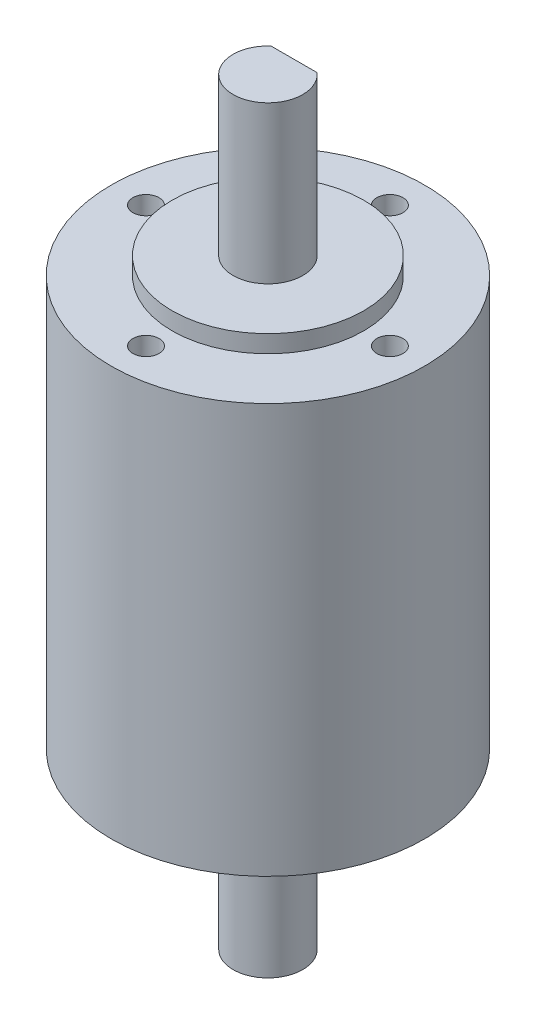
ISO-10303-21;
HEADER;
FILE_DESCRIPTION(('STEP AP214'),'2;1');
FILE_NAME('part.step','',(''),(''),'','','');
FILE_SCHEMA(('AUTOMOTIVE_DESIGN { 1 0 10303 214 1 1 1 1 }'));
ENDSEC;
DATA;
#1=APPLICATION_CONTEXT('core data for automotive mechanical design processes');
#2=APPLICATION_PROTOCOL_DEFINITION('international standard','automotive_design',2000,#1);
#3=PRODUCT_CONTEXT('',#1,'mechanical');
#4=PRODUCT('Part','Part','',(#3));
#5=PRODUCT_RELATED_PRODUCT_CATEGORY('part','',(#4));
#6=PRODUCT_DEFINITION_FORMATION('','',#4);
#7=PRODUCT_DEFINITION_CONTEXT('part definition',#1,'design');
#8=PRODUCT_DEFINITION('design','',#6,#7);
#9=PRODUCT_DEFINITION_SHAPE('','',#8);
#10=(LENGTH_UNIT() NAMED_UNIT(*) SI_UNIT(.MILLI.,.METRE.));
#11=(NAMED_UNIT(*) PLANE_ANGLE_UNIT() SI_UNIT($,.RADIAN.));
#12=(NAMED_UNIT(*) SI_UNIT($,.STERADIAN.) SOLID_ANGLE_UNIT());
#13=UNCERTAINTY_MEASURE_WITH_UNIT(LENGTH_MEASURE(1.E-05),#10,'distance_accuracy_value','');
#14=(GEOMETRIC_REPRESENTATION_CONTEXT(3) GLOBAL_UNCERTAINTY_ASSIGNED_CONTEXT((#13)) GLOBAL_UNIT_ASSIGNED_CONTEXT((#10,
#11,#12)) REPRESENTATION_CONTEXT('',''));
#15=CARTESIAN_POINT('',(0.,0.,0.));
#16=DIRECTION('',(0.,0.,1.));
#17=DIRECTION('',(1.,0.,0.));
#18=AXIS2_PLACEMENT_3D('',#15,#16,#17);
#19=CARTESIAN_POINT('',(0.,47.,0.));
#20=DIRECTION('',(0.,-1.,0.));
#21=DIRECTION('',(0.,0.,-1.));
#22=AXIS2_PLACEMENT_3D('',#19,#20,#21);
#23=CYLINDRICAL_SURFACE('',#22,18.);
#24=CARTESIAN_POINT('',(0.,47.,0.));
#25=DIRECTION('',(0.,1.,0.));
#26=DIRECTION('',(0.,0.,1.));
#27=AXIS2_PLACEMENT_3D('',#24,#25,#26);
#28=CIRCLE('',#27,18.);
#29=CARTESIAN_POINT('',(0.,47.,18.));
#30=VERTEX_POINT('',#29);
#31=EDGE_CURVE('E114',#30,#30,#28,.T.);
#32=ORIENTED_EDGE('',*,*,#31,.F.);
#33=EDGE_LOOP('',(#32));
#34=FACE_BOUND('',#33,.T.);
#35=CARTESIAN_POINT('',(0.,0.,0.));
#36=DIRECTION('',(0.,1.,0.));
#37=DIRECTION('',(0.,0.,1.));
#38=AXIS2_PLACEMENT_3D('',#35,#36,#37);
#39=CIRCLE('',#38,18.);
#40=CARTESIAN_POINT('',(0.,0.,18.));
#41=VERTEX_POINT('',#40);
#42=EDGE_CURVE('E111',#41,#41,#39,.T.);
#43=ORIENTED_EDGE('',*,*,#42,.T.);
#44=EDGE_LOOP('',(#43));
#45=FACE_BOUND('',#44,.T.);
#46=ADVANCED_FACE('F37',(#34,#45),#23,.T.);
#47=CARTESIAN_POINT('',(0.,47.,0.));
#48=DIRECTION('',(0.,1.,0.));
#49=DIRECTION('',(0.,0.,1.));
#50=AXIS2_PLACEMENT_3D('',#47,#48,#49);
#51=PLANE('',#50);
#52=CARTESIAN_POINT('',(-14.,47.,0.));
#53=DIRECTION('',(0.,1.,0.));
#54=DIRECTION('',(0.,0.,1.));
#55=AXIS2_PLACEMENT_3D('',#52,#53,#54);
#56=CIRCLE('',#55,1.5);
#57=CARTESIAN_POINT('',(-14.,47.,1.5));
#58=VERTEX_POINT('',#57);
#59=EDGE_CURVE('E182',#58,#58,#56,.T.);
#60=ORIENTED_EDGE('',*,*,#59,.F.);
#61=EDGE_LOOP('',(#60));
#62=FACE_BOUND('',#61,.T.);
#63=CARTESIAN_POINT('',(0.,47.,-14.));
#64=DIRECTION('',(0.,1.,0.));
#65=DIRECTION('',(0.,0.,1.));
#66=AXIS2_PLACEMENT_3D('',#63,#64,#65);
#67=CIRCLE('',#66,1.5);
#68=CARTESIAN_POINT('',(0.,47.,-12.5));
#69=VERTEX_POINT('',#68);
#70=EDGE_CURVE('E176',#69,#69,#67,.T.);
#71=ORIENTED_EDGE('',*,*,#70,.F.);
#72=EDGE_LOOP('',(#71));
#73=FACE_BOUND('',#72,.T.);
#74=CARTESIAN_POINT('',(14.,47.,0.));
#75=DIRECTION('',(0.,1.,0.));
#76=DIRECTION('',(0.,0.,1.));
#77=AXIS2_PLACEMENT_3D('',#74,#75,#76);
#78=CIRCLE('',#77,1.5);
#79=CARTESIAN_POINT('',(14.,47.,1.5));
#80=VERTEX_POINT('',#79);
#81=EDGE_CURVE('E170',#80,#80,#78,.T.);
#82=ORIENTED_EDGE('',*,*,#81,.F.);
#83=EDGE_LOOP('',(#82));
#84=FACE_BOUND('',#83,.T.);
#85=CARTESIAN_POINT('',(0.,47.,14.));
#86=DIRECTION('',(0.,1.,0.));
#87=DIRECTION('',(0.,0.,1.));
#88=AXIS2_PLACEMENT_3D('',#85,#86,#87);
#89=CIRCLE('',#88,1.5);
#90=CARTESIAN_POINT('',(0.,47.,15.5));
#91=VERTEX_POINT('',#90);
#92=EDGE_CURVE('E164',#91,#91,#89,.T.);
#93=ORIENTED_EDGE('',*,*,#92,.F.);
#94=EDGE_LOOP('',(#93));
#95=FACE_BOUND('',#94,.T.);
#96=CARTESIAN_POINT('',(0.,47.,0.));
#97=DIRECTION('',(0.,1.,0.));
#98=DIRECTION('',(0.,0.,1.));
#99=AXIS2_PLACEMENT_3D('',#96,#97,#98);
#100=CIRCLE('',#99,11.);
#101=CARTESIAN_POINT('',(0.,47.,11.));
#102=VERTEX_POINT('',#101);
#103=EDGE_CURVE('E108',#102,#102,#100,.T.);
#104=ORIENTED_EDGE('',*,*,#103,.F.);
#105=EDGE_LOOP('',(#104));
#106=FACE_BOUND('',#105,.T.);
#107=ORIENTED_EDGE('',*,*,#31,.T.);
#108=EDGE_LOOP('',(#107));
#109=FACE_BOUND('',#108,.T.);
#110=ADVANCED_FACE('F197',(#62,#73,#84,#95,#106,#109),#51,.T.);
#111=CARTESIAN_POINT('',(0.,0.,0.));
#112=DIRECTION('',(0.,1.,0.));
#113=DIRECTION('',(0.,0.,1.));
#114=AXIS2_PLACEMENT_3D('',#111,#112,#113);
#115=PLANE('',#114);
#116=CARTESIAN_POINT('',(0.,0.,14.));
#117=DIRECTION('',(0.,-1.,0.));
#118=DIRECTION('',(0.,0.,-1.));
#119=AXIS2_PLACEMENT_3D('',#116,#117,#118);
#120=CIRCLE('',#119,1.5);
#121=CARTESIAN_POINT('',(0.,0.,12.5));
#122=VERTEX_POINT('',#121);
#123=EDGE_CURVE('E159',#122,#122,#120,.T.);
#124=ORIENTED_EDGE('',*,*,#123,.F.);
#125=EDGE_LOOP('',(#124));
#126=FACE_BOUND('',#125,.T.);
#127=CARTESIAN_POINT('',(14.,0.,0.));
#128=DIRECTION('',(0.,-1.,0.));
#129=DIRECTION('',(0.,0.,-1.));
#130=AXIS2_PLACEMENT_3D('',#127,#128,#129);
#131=CIRCLE('',#130,1.5);
#132=CARTESIAN_POINT('',(14.,0.,-1.5));
#133=VERTEX_POINT('',#132);
#134=EDGE_CURVE('E153',#133,#133,#131,.T.);
#135=ORIENTED_EDGE('',*,*,#134,.F.);
#136=EDGE_LOOP('',(#135));
#137=FACE_BOUND('',#136,.T.);
#138=CARTESIAN_POINT('',(0.,0.,-14.));
#139=DIRECTION('',(0.,-1.,0.));
#140=DIRECTION('',(0.,0.,-1.));
#141=AXIS2_PLACEMENT_3D('',#138,#139,#140);
#142=CIRCLE('',#141,1.5);
#143=CARTESIAN_POINT('',(0.,0.,-15.5));
#144=VERTEX_POINT('',#143);
#145=EDGE_CURVE('E147',#144,#144,#142,.T.);
#146=ORIENTED_EDGE('',*,*,#145,.F.);
#147=EDGE_LOOP('',(#146));
#148=FACE_BOUND('',#147,.T.);
#149=CARTESIAN_POINT('',(-14.,0.,0.));
#150=DIRECTION('',(0.,-1.,0.));
#151=DIRECTION('',(0.,0.,-1.));
#152=AXIS2_PLACEMENT_3D('',#149,#150,#151);
#153=CIRCLE('',#152,1.5);
#154=CARTESIAN_POINT('',(-14.,0.,-1.5));
#155=VERTEX_POINT('',#154);
#156=EDGE_CURVE('E140',#155,#155,#153,.T.);
#157=ORIENTED_EDGE('',*,*,#156,.F.);
#158=EDGE_LOOP('',(#157));
#159=FACE_BOUND('',#158,.T.);
#160=CARTESIAN_POINT('',(0.,0.,0.));
#161=DIRECTION('',(0.,-1.,0.));
#162=DIRECTION('',(0.,0.,-1.));
#163=AXIS2_PLACEMENT_3D('',#160,#161,#162);
#164=CIRCLE('',#163,11.);
#165=CARTESIAN_POINT('',(0.,0.,-11.));
#166=VERTEX_POINT('',#165);
#167=EDGE_CURVE('E104',#166,#166,#164,.T.);
#168=ORIENTED_EDGE('',*,*,#167,.F.);
#169=EDGE_LOOP('',(#168));
#170=FACE_BOUND('',#169,.T.);
#171=ORIENTED_EDGE('',*,*,#42,.F.);
#172=EDGE_LOOP('',(#171));
#173=FACE_BOUND('',#172,.T.);
#174=ADVANCED_FACE('F200',(#126,#137,#148,#159,#170,#173),#115,.F.);
#175=CARTESIAN_POINT('',(0.,49.,0.));
#176=DIRECTION('',(0.,-1.,0.));
#177=DIRECTION('',(0.,0.,-1.));
#178=AXIS2_PLACEMENT_3D('',#175,#176,#177);
#179=CYLINDRICAL_SURFACE('',#178,11.);
#180=CARTESIAN_POINT('',(0.,49.,0.));
#181=DIRECTION('',(0.,1.,0.));
#182=DIRECTION('',(0.,0.,1.));
#183=AXIS2_PLACEMENT_3D('',#180,#181,#182);
#184=CIRCLE('',#183,11.);
#185=CARTESIAN_POINT('',(0.,49.,11.));
#186=VERTEX_POINT('',#185);
#187=EDGE_CURVE('E95',#186,#186,#184,.T.);
#188=ORIENTED_EDGE('',*,*,#187,.F.);
#189=EDGE_LOOP('',(#188));
#190=FACE_BOUND('',#189,.T.);
#191=ORIENTED_EDGE('',*,*,#103,.T.);
#192=EDGE_LOOP('',(#191));
#193=FACE_BOUND('',#192,.T.);
#194=ADVANCED_FACE('F217',(#190,#193),#179,.T.);
#195=CARTESIAN_POINT('',(0.,49.,0.));
#196=DIRECTION('',(0.,1.,0.));
#197=DIRECTION('',(0.,0.,1.));
#198=AXIS2_PLACEMENT_3D('',#195,#196,#197);
#199=PLANE('',#198);
#200=CARTESIAN_POINT('',(0.,49.,0.));
#201=DIRECTION('',(0.,1.,0.));
#202=DIRECTION('',(0.,0.,1.));
#203=AXIS2_PLACEMENT_3D('',#200,#201,#202);
#204=CIRCLE('',#203,4.);
#205=CARTESIAN_POINT('',(0.,49.,4.));
#206=VERTEX_POINT('',#205);
#207=EDGE_CURVE('E101',#206,#206,#204,.T.);
#208=ORIENTED_EDGE('',*,*,#207,.F.);
#209=EDGE_LOOP('',(#208));
#210=FACE_BOUND('',#209,.T.);
#211=ORIENTED_EDGE('',*,*,#187,.T.);
#212=EDGE_LOOP('',(#211));
#213=FACE_BOUND('',#212,.T.);
#214=ADVANCED_FACE('F222',(#210,#213),#199,.T.);
#215=CARTESIAN_POINT('',(0.,-2.,0.));
#216=DIRECTION('',(0.,1.,0.));
#217=DIRECTION('',(0.,0.,1.));
#218=AXIS2_PLACEMENT_3D('',#215,#216,#217);
#219=CYLINDRICAL_SURFACE('',#218,11.);
#220=CARTESIAN_POINT('',(0.,-2.,0.));
#221=DIRECTION('',(0.,-1.,0.));
#222=DIRECTION('',(0.,0.,-1.));
#223=AXIS2_PLACEMENT_3D('',#220,#221,#222);
#224=CIRCLE('',#223,11.);
#225=CARTESIAN_POINT('',(0.,-2.,-11.));
#226=VERTEX_POINT('',#225);
#227=EDGE_CURVE('E91',#226,#226,#224,.T.);
#228=ORIENTED_EDGE('',*,*,#227,.F.);
#229=EDGE_LOOP('',(#228));
#230=FACE_BOUND('',#229,.T.);
#231=ORIENTED_EDGE('',*,*,#167,.T.);
#232=EDGE_LOOP('',(#231));
#233=FACE_BOUND('',#232,.T.);
#234=ADVANCED_FACE('F230',(#230,#233),#219,.T.);
#235=CARTESIAN_POINT('',(0.,-2.,0.));
#236=DIRECTION('',(0.,-1.,0.));
#237=DIRECTION('',(0.,0.,-1.));
#238=AXIS2_PLACEMENT_3D('',#235,#236,#237);
#239=PLANE('',#238);
#240=CARTESIAN_POINT('',(0.,-2.,0.));
#241=DIRECTION('',(0.,-1.,0.));
#242=DIRECTION('',(0.,0.,-1.));
#243=AXIS2_PLACEMENT_3D('',#240,#241,#242);
#244=CIRCLE('',#243,4.);
#245=CARTESIAN_POINT('',(0.,-2.,-4.));
#246=VERTEX_POINT('',#245);
#247=EDGE_CURVE('E102',#246,#246,#244,.T.);
#248=ORIENTED_EDGE('',*,*,#247,.F.);
#249=EDGE_LOOP('',(#248));
#250=FACE_BOUND('',#249,.T.);
#251=ORIENTED_EDGE('',*,*,#227,.T.);
#252=EDGE_LOOP('',(#251));
#253=FACE_BOUND('',#252,.T.);
#254=ADVANCED_FACE('F234',(#250,#253),#239,.T.);
#255=CARTESIAN_POINT('',(0.,-20.,0.));
#256=DIRECTION('',(0.,1.,0.));
#257=DIRECTION('',(0.,0.,1.));
#258=AXIS2_PLACEMENT_3D('',#255,#256,#257);
#259=CYLINDRICAL_SURFACE('',#258,4.);
#260=CARTESIAN_POINT('',(0.,-20.,0.));
#261=DIRECTION('',(0.,-1.,0.));
#262=DIRECTION('',(0.,0.,-1.));
#263=AXIS2_PLACEMENT_3D('',#260,#261,#262);
#264=CIRCLE('',#263,4.);
#265=CARTESIAN_POINT('',(2.64575131106459,-20.,-3.));
#266=VERTEX_POINT('',#265);
#267=CARTESIAN_POINT('',(-2.64575131106459,-20.,-3.));
#268=VERTEX_POINT('',#267);
#269=EDGE_CURVE('E87',#266,#268,#264,.T.);
#270=ORIENTED_EDGE('',*,*,#269,.F.);
#271=DIRECTION('',(0.,1.,0.));
#272=VECTOR('',#271,1.);
#273=CARTESIAN_POINT('',(2.64575131106459,-20.,-3.));
#274=LINE('',#273,#272);
#275=CARTESIAN_POINT('',(2.64575131106459,-5.,-3.));
#276=VERTEX_POINT('',#275);
#277=EDGE_CURVE('E51',#266,#276,#274,.T.);
#278=ORIENTED_EDGE('',*,*,#277,.T.);
#279=CARTESIAN_POINT('',(0.,-5.,0.));
#280=DIRECTION('',(0.,-1.,0.));
#281=DIRECTION('',(0.,0.,-1.));
#282=AXIS2_PLACEMENT_3D('',#279,#280,#281);
#283=CIRCLE('',#282,4.);
#284=CARTESIAN_POINT('',(-2.64575131106459,-5.,-3.));
#285=VERTEX_POINT('',#284);
#286=EDGE_CURVE('E11',#285,#276,#283,.T.);
#287=ORIENTED_EDGE('',*,*,#286,.F.);
#288=DIRECTION('',(0.,1.,0.));
#289=VECTOR('',#288,1.);
#290=CARTESIAN_POINT('',(-2.64575131106459,-20.,-3.));
#291=LINE('',#290,#289);
#292=EDGE_CURVE('E77',#285,#268,#291,.F.);
#293=ORIENTED_EDGE('',*,*,#292,.T.);
#294=EDGE_LOOP('',(#270,#278,#287,#293));
#295=FACE_BOUND('',#294,.T.);
#296=ORIENTED_EDGE('',*,*,#247,.T.);
#297=EDGE_LOOP('',(#296));
#298=FACE_BOUND('',#297,.T.);
#299=ADVANCED_FACE('F85',(#295,#298),#259,.T.);
#300=CARTESIAN_POINT('',(0.,-20.,0.));
#301=DIRECTION('',(0.,-1.,0.));
#302=DIRECTION('',(0.,0.,-1.));
#303=AXIS2_PLACEMENT_3D('',#300,#301,#302);
#304=PLANE('',#303);
#305=DIRECTION('',(-1.,0.,0.));
#306=VECTOR('',#305,1.);
#307=CARTESIAN_POINT('',(0.,-20.,-3.));
#308=LINE('',#307,#306);
#309=EDGE_CURVE('E44',#266,#268,#308,.T.);
#310=ORIENTED_EDGE('',*,*,#309,.F.);
#311=ORIENTED_EDGE('',*,*,#269,.T.);
#312=EDGE_LOOP('',(#310,#311));
#313=FACE_BOUND('',#312,.T.);
#314=ADVANCED_FACE('F90',(#313),#304,.T.);
#315=CARTESIAN_POINT('',(0.,67.,0.));
#316=DIRECTION('',(0.,-1.,0.));
#317=DIRECTION('',(0.,0.,-1.));
#318=AXIS2_PLACEMENT_3D('',#315,#316,#317);
#319=CYLINDRICAL_SURFACE('',#318,4.);
#320=CARTESIAN_POINT('',(0.,67.,0.));
#321=DIRECTION('',(0.,1.,0.));
#322=DIRECTION('',(0.,0.,1.));
#323=AXIS2_PLACEMENT_3D('',#320,#321,#322);
#324=CIRCLE('',#323,4.);
#325=CARTESIAN_POINT('',(-2.64575131106459,67.,-3.));
#326=VERTEX_POINT('',#325);
#327=CARTESIAN_POINT('',(2.64575131106459,67.,-3.));
#328=VERTEX_POINT('',#327);
#329=EDGE_CURVE('E92',#326,#328,#324,.T.);
#330=ORIENTED_EDGE('',*,*,#329,.F.);
#331=DIRECTION('',(0.,-1.,0.));
#332=VECTOR('',#331,1.);
#333=CARTESIAN_POINT('',(-2.64575131106459,67.,-3.));
#334=LINE('',#333,#332);
#335=CARTESIAN_POINT('',(-2.64575131106459,52.,-3.));
#336=VERTEX_POINT('',#335);
#337=EDGE_CURVE('E59',#326,#336,#334,.T.);
#338=ORIENTED_EDGE('',*,*,#337,.T.);
#339=CARTESIAN_POINT('',(0.,52.,0.));
#340=DIRECTION('',(0.,-1.,0.));
#341=DIRECTION('',(0.,0.,-1.));
#342=AXIS2_PLACEMENT_3D('',#339,#340,#341);
#343=CIRCLE('',#342,4.);
#344=CARTESIAN_POINT('',(2.64575131106459,52.,-3.));
#345=VERTEX_POINT('',#344);
#346=EDGE_CURVE('E82',#336,#345,#343,.T.);
#347=ORIENTED_EDGE('',*,*,#346,.T.);
#348=DIRECTION('',(0.,-1.,0.));
#349=VECTOR('',#348,1.);
#350=CARTESIAN_POINT('',(2.64575131106459,67.,-3.));
#351=LINE('',#350,#349);
#352=EDGE_CURVE('E127',#345,#328,#351,.F.);
#353=ORIENTED_EDGE('',*,*,#352,.T.);
#354=EDGE_LOOP('',(#330,#338,#347,#353));
#355=FACE_BOUND('',#354,.T.);
#356=ORIENTED_EDGE('',*,*,#207,.T.);
#357=EDGE_LOOP('',(#356));
#358=FACE_BOUND('',#357,.T.);
#359=ADVANCED_FACE('F125',(#355,#358),#319,.T.);
#360=CARTESIAN_POINT('',(0.,67.,0.));
#361=DIRECTION('',(0.,1.,0.));
#362=DIRECTION('',(0.,0.,1.));
#363=AXIS2_PLACEMENT_3D('',#360,#361,#362);
#364=PLANE('',#363);
#365=DIRECTION('',(1.,0.,0.));
#366=VECTOR('',#365,1.);
#367=CARTESIAN_POINT('',(0.,67.,-3.));
#368=LINE('',#367,#366);
#369=EDGE_CURVE('E119',#326,#328,#368,.T.);
#370=ORIENTED_EDGE('',*,*,#369,.F.);
#371=ORIENTED_EDGE('',*,*,#329,.T.);
#372=EDGE_LOOP('',(#370,#371));
#373=FACE_BOUND('',#372,.T.);
#374=ADVANCED_FACE('F245',(#373),#364,.T.);
#375=CARTESIAN_POINT('',(0.,52.,0.));
#376=DIRECTION('',(0.,-1.,0.));
#377=DIRECTION('',(0.,0.,-1.));
#378=AXIS2_PLACEMENT_3D('',#375,#376,#377);
#379=PLANE('',#378);
#380=DIRECTION('',(1.,0.,0.));
#381=VECTOR('',#380,1.);
#382=CARTESIAN_POINT('',(-4.7940074906367,52.,-3.));
#383=LINE('',#382,#381);
#384=EDGE_CURVE('E131',#336,#345,#383,.T.);
#385=ORIENTED_EDGE('',*,*,#384,.T.);
#386=ORIENTED_EDGE('',*,*,#346,.F.);
#387=EDGE_LOOP('',(#385,#386));
#388=FACE_BOUND('',#387,.T.);
#389=ADVANCED_FACE('F130',(#388),#379,.F.);
#390=CARTESIAN_POINT('',(-4.7940074906367,52.,-3.));
#391=DIRECTION('',(0.,0.,1.));
#392=DIRECTION('',(1.,0.,0.));
#393=AXIS2_PLACEMENT_3D('',#390,#391,#392);
#394=PLANE('',#393);
#395=ORIENTED_EDGE('',*,*,#369,.T.);
#396=ORIENTED_EDGE('',*,*,#352,.F.);
#397=ORIENTED_EDGE('',*,*,#384,.F.);
#398=ORIENTED_EDGE('',*,*,#337,.F.);
#399=EDGE_LOOP('',(#395,#396,#397,#398));
#400=FACE_BOUND('',#399,.T.);
#401=ADVANCED_FACE('F132',(#400),#394,.F.);
#402=CARTESIAN_POINT('',(0.,-5.,0.));
#403=DIRECTION('',(0.,-1.,0.));
#404=DIRECTION('',(0.,0.,-1.));
#405=AXIS2_PLACEMENT_3D('',#402,#403,#404);
#406=PLANE('',#405);
#407=ORIENTED_EDGE('',*,*,#286,.T.);
#408=DIRECTION('',(-1.,0.,0.));
#409=VECTOR('',#408,1.);
#410=CARTESIAN_POINT('',(4.45842696629214,-5.,-3.));
#411=LINE('',#410,#409);
#412=EDGE_CURVE('E88',#276,#285,#411,.T.);
#413=ORIENTED_EDGE('',*,*,#412,.T.);
#414=EDGE_LOOP('',(#407,#413));
#415=FACE_BOUND('',#414,.T.);
#416=ADVANCED_FACE('F251',(#415),#406,.T.);
#417=CARTESIAN_POINT('',(4.45842696629214,-5.,-3.));
#418=DIRECTION('',(0.,0.,1.));
#419=DIRECTION('',(1.,0.,0.));
#420=AXIS2_PLACEMENT_3D('',#417,#418,#419);
#421=PLANE('',#420);
#422=ORIENTED_EDGE('',*,*,#309,.T.);
#423=ORIENTED_EDGE('',*,*,#292,.F.);
#424=ORIENTED_EDGE('',*,*,#412,.F.);
#425=ORIENTED_EDGE('',*,*,#277,.F.);
#426=EDGE_LOOP('',(#422,#423,#424,#425));
#427=FACE_BOUND('',#426,.T.);
#428=ADVANCED_FACE('F76',(#427),#421,.F.);
#429=CARTESIAN_POINT('',(-14.,6.,0.));
#430=DIRECTION('',(0.,-1.,0.));
#431=DIRECTION('',(0.,0.,-1.));
#432=AXIS2_PLACEMENT_3D('',#429,#430,#431);
#433=CYLINDRICAL_SURFACE('',#432,1.5);
#434=CARTESIAN_POINT('',(-14.,6.,0.));
#435=DIRECTION('',(0.,-1.,0.));
#436=DIRECTION('',(0.,0.,-1.));
#437=AXIS2_PLACEMENT_3D('',#434,#435,#436);
#438=CIRCLE('',#437,1.5);
#439=CARTESIAN_POINT('',(-14.,6.,-1.5));
#440=VERTEX_POINT('',#439);
#441=EDGE_CURVE('E143',#440,#440,#438,.T.);
#442=ORIENTED_EDGE('',*,*,#441,.F.);
#443=EDGE_LOOP('',(#442));
#444=FACE_BOUND('',#443,.T.);
#445=ORIENTED_EDGE('',*,*,#156,.T.);
#446=EDGE_LOOP('',(#445));
#447=FACE_BOUND('',#446,.T.);
#448=ADVANCED_FACE('F256',(#444,#447),#433,.F.);
#449=CARTESIAN_POINT('',(-14.,6.,0.));
#450=DIRECTION('',(0.,-1.,0.));
#451=DIRECTION('',(0.,0.,-1.));
#452=AXIS2_PLACEMENT_3D('',#449,#450,#451);
#453=PLANE('',#452);
#454=ORIENTED_EDGE('',*,*,#441,.T.);
#455=EDGE_LOOP('',(#454));
#456=FACE_BOUND('',#455,.T.);
#457=ADVANCED_FACE('F262',(#456),#453,.T.);
#458=CARTESIAN_POINT('',(0.,6.,-14.));
#459=DIRECTION('',(0.,-1.,0.));
#460=DIRECTION('',(0.,0.,-1.));
#461=AXIS2_PLACEMENT_3D('',#458,#459,#460);
#462=CYLINDRICAL_SURFACE('',#461,1.5);
#463=CARTESIAN_POINT('',(0.,6.,-14.));
#464=DIRECTION('',(0.,-1.,0.));
#465=DIRECTION('',(0.,0.,-1.));
#466=AXIS2_PLACEMENT_3D('',#463,#464,#465);
#467=CIRCLE('',#466,1.5);
#468=CARTESIAN_POINT('',(0.,6.,-15.5));
#469=VERTEX_POINT('',#468);
#470=EDGE_CURVE('E150',#469,#469,#467,.T.);
#471=ORIENTED_EDGE('',*,*,#470,.F.);
#472=EDGE_LOOP('',(#471));
#473=FACE_BOUND('',#472,.T.);
#474=ORIENTED_EDGE('',*,*,#145,.T.);
#475=EDGE_LOOP('',(#474));
#476=FACE_BOUND('',#475,.T.);
#477=ADVANCED_FACE('F266',(#473,#476),#462,.F.);
#478=CARTESIAN_POINT('',(0.,6.,-14.));
#479=DIRECTION('',(0.,-1.,0.));
#480=DIRECTION('',(0.,0.,-1.));
#481=AXIS2_PLACEMENT_3D('',#478,#479,#480);
#482=PLANE('',#481);
#483=ORIENTED_EDGE('',*,*,#470,.T.);
#484=EDGE_LOOP('',(#483));
#485=FACE_BOUND('',#484,.T.);
#486=ADVANCED_FACE('F270',(#485),#482,.T.);
#487=CARTESIAN_POINT('',(14.,6.,0.));
#488=DIRECTION('',(0.,-1.,0.));
#489=DIRECTION('',(0.,0.,-1.));
#490=AXIS2_PLACEMENT_3D('',#487,#488,#489);
#491=CYLINDRICAL_SURFACE('',#490,1.5);
#492=CARTESIAN_POINT('',(14.,6.,0.));
#493=DIRECTION('',(0.,-1.,0.));
#494=DIRECTION('',(0.,0.,-1.));
#495=AXIS2_PLACEMENT_3D('',#492,#493,#494);
#496=CIRCLE('',#495,1.5);
#497=CARTESIAN_POINT('',(14.,6.,-1.5));
#498=VERTEX_POINT('',#497);
#499=EDGE_CURVE('E156',#498,#498,#496,.T.);
#500=ORIENTED_EDGE('',*,*,#499,.F.);
#501=EDGE_LOOP('',(#500));
#502=FACE_BOUND('',#501,.T.);
#503=ORIENTED_EDGE('',*,*,#134,.T.);
#504=EDGE_LOOP('',(#503));
#505=FACE_BOUND('',#504,.T.);
#506=ADVANCED_FACE('F274',(#502,#505),#491,.F.);
#507=CARTESIAN_POINT('',(14.,6.,0.));
#508=DIRECTION('',(0.,-1.,0.));
#509=DIRECTION('',(0.,0.,-1.));
#510=AXIS2_PLACEMENT_3D('',#507,#508,#509);
#511=PLANE('',#510);
#512=ORIENTED_EDGE('',*,*,#499,.T.);
#513=EDGE_LOOP('',(#512));
#514=FACE_BOUND('',#513,.T.);
#515=ADVANCED_FACE('F278',(#514),#511,.T.);
#516=CARTESIAN_POINT('',(0.,6.,14.));
#517=DIRECTION('',(0.,-1.,0.));
#518=DIRECTION('',(0.,0.,-1.));
#519=AXIS2_PLACEMENT_3D('',#516,#517,#518);
#520=CYLINDRICAL_SURFACE('',#519,1.5);
#521=CARTESIAN_POINT('',(0.,6.,14.));
#522=DIRECTION('',(0.,-1.,0.));
#523=DIRECTION('',(0.,0.,-1.));
#524=AXIS2_PLACEMENT_3D('',#521,#522,#523);
#525=CIRCLE('',#524,1.5);
#526=CARTESIAN_POINT('',(0.,6.,12.5));
#527=VERTEX_POINT('',#526);
#528=EDGE_CURVE('E139',#527,#527,#525,.T.);
#529=ORIENTED_EDGE('',*,*,#528,.F.);
#530=EDGE_LOOP('',(#529));
#531=FACE_BOUND('',#530,.T.);
#532=ORIENTED_EDGE('',*,*,#123,.T.);
#533=EDGE_LOOP('',(#532));
#534=FACE_BOUND('',#533,.T.);
#535=ADVANCED_FACE('F282',(#531,#534),#520,.F.);
#536=CARTESIAN_POINT('',(0.,6.,14.));
#537=DIRECTION('',(0.,-1.,0.));
#538=DIRECTION('',(0.,0.,-1.));
#539=AXIS2_PLACEMENT_3D('',#536,#537,#538);
#540=PLANE('',#539);
#541=ORIENTED_EDGE('',*,*,#528,.T.);
#542=EDGE_LOOP('',(#541));
#543=FACE_BOUND('',#542,.T.);
#544=ADVANCED_FACE('F286',(#543),#540,.T.);
#545=CARTESIAN_POINT('',(0.,41.,14.));
#546=DIRECTION('',(0.,1.,0.));
#547=DIRECTION('',(0.,0.,1.));
#548=AXIS2_PLACEMENT_3D('',#545,#546,#547);
#549=CYLINDRICAL_SURFACE('',#548,1.5);
#550=CARTESIAN_POINT('',(0.,41.,14.));
#551=DIRECTION('',(0.,1.,0.));
#552=DIRECTION('',(0.,0.,1.));
#553=AXIS2_PLACEMENT_3D('',#550,#551,#552);
#554=CIRCLE('',#553,1.5);
#555=CARTESIAN_POINT('',(0.,41.,15.5));
#556=VERTEX_POINT('',#555);
#557=EDGE_CURVE('E167',#556,#556,#554,.T.);
#558=ORIENTED_EDGE('',*,*,#557,.F.);
#559=EDGE_LOOP('',(#558));
#560=FACE_BOUND('',#559,.T.);
#561=ORIENTED_EDGE('',*,*,#92,.T.);
#562=EDGE_LOOP('',(#561));
#563=FACE_BOUND('',#562,.T.);
#564=ADVANCED_FACE('F290',(#560,#563),#549,.F.);
#565=CARTESIAN_POINT('',(0.,41.,14.));
#566=DIRECTION('',(0.,1.,0.));
#567=DIRECTION('',(0.,0.,1.));
#568=AXIS2_PLACEMENT_3D('',#565,#566,#567);
#569=PLANE('',#568);
#570=ORIENTED_EDGE('',*,*,#557,.T.);
#571=EDGE_LOOP('',(#570));
#572=FACE_BOUND('',#571,.T.);
#573=ADVANCED_FACE('F294',(#572),#569,.T.);
#574=CARTESIAN_POINT('',(14.,41.,0.));
#575=DIRECTION('',(0.,1.,0.));
#576=DIRECTION('',(0.,0.,1.));
#577=AXIS2_PLACEMENT_3D('',#574,#575,#576);
#578=CYLINDRICAL_SURFACE('',#577,1.5);
#579=CARTESIAN_POINT('',(14.,41.,0.));
#580=DIRECTION('',(0.,1.,0.));
#581=DIRECTION('',(0.,0.,1.));
#582=AXIS2_PLACEMENT_3D('',#579,#580,#581);
#583=CIRCLE('',#582,1.5);
#584=CARTESIAN_POINT('',(14.,41.,1.5));
#585=VERTEX_POINT('',#584);
#586=EDGE_CURVE('E173',#585,#585,#583,.T.);
#587=ORIENTED_EDGE('',*,*,#586,.F.);
#588=EDGE_LOOP('',(#587));
#589=FACE_BOUND('',#588,.T.);
#590=ORIENTED_EDGE('',*,*,#81,.T.);
#591=EDGE_LOOP('',(#590));
#592=FACE_BOUND('',#591,.T.);
#593=ADVANCED_FACE('F298',(#589,#592),#578,.F.);
#594=CARTESIAN_POINT('',(14.,41.,0.));
#595=DIRECTION('',(0.,1.,0.));
#596=DIRECTION('',(0.,0.,1.));
#597=AXIS2_PLACEMENT_3D('',#594,#595,#596);
#598=PLANE('',#597);
#599=ORIENTED_EDGE('',*,*,#586,.T.);
#600=EDGE_LOOP('',(#599));
#601=FACE_BOUND('',#600,.T.);
#602=ADVANCED_FACE('F302',(#601),#598,.T.);
#603=CARTESIAN_POINT('',(0.,41.,-14.));
#604=DIRECTION('',(0.,1.,0.));
#605=DIRECTION('',(0.,0.,1.));
#606=AXIS2_PLACEMENT_3D('',#603,#604,#605);
#607=CYLINDRICAL_SURFACE('',#606,1.5);
#608=CARTESIAN_POINT('',(0.,41.,-14.));
#609=DIRECTION('',(0.,1.,0.));
#610=DIRECTION('',(0.,0.,1.));
#611=AXIS2_PLACEMENT_3D('',#608,#609,#610);
#612=CIRCLE('',#611,1.5);
#613=CARTESIAN_POINT('',(0.,41.,-12.5));
#614=VERTEX_POINT('',#613);
#615=EDGE_CURVE('E179',#614,#614,#612,.T.);
#616=ORIENTED_EDGE('',*,*,#615,.F.);
#617=EDGE_LOOP('',(#616));
#618=FACE_BOUND('',#617,.T.);
#619=ORIENTED_EDGE('',*,*,#70,.T.);
#620=EDGE_LOOP('',(#619));
#621=FACE_BOUND('',#620,.T.);
#622=ADVANCED_FACE('F306',(#618,#621),#607,.F.);
#623=CARTESIAN_POINT('',(0.,41.,-14.));
#624=DIRECTION('',(0.,1.,0.));
#625=DIRECTION('',(0.,0.,1.));
#626=AXIS2_PLACEMENT_3D('',#623,#624,#625);
#627=PLANE('',#626);
#628=ORIENTED_EDGE('',*,*,#615,.T.);
#629=EDGE_LOOP('',(#628));
#630=FACE_BOUND('',#629,.T.);
#631=ADVANCED_FACE('F193',(#630),#627,.T.);
#632=CARTESIAN_POINT('',(-14.,41.,0.));
#633=DIRECTION('',(0.,1.,0.));
#634=DIRECTION('',(0.,0.,1.));
#635=AXIS2_PLACEMENT_3D('',#632,#633,#634);
#636=CYLINDRICAL_SURFACE('',#635,1.5);
#637=CARTESIAN_POINT('',(-14.,41.,0.));
#638=DIRECTION('',(0.,1.,0.));
#639=DIRECTION('',(0.,0.,1.));
#640=AXIS2_PLACEMENT_3D('',#637,#638,#639);
#641=CIRCLE('',#640,1.5);
#642=CARTESIAN_POINT('',(-14.,41.,1.5));
#643=VERTEX_POINT('',#642);
#644=EDGE_CURVE('E144',#643,#643,#641,.T.);
#645=ORIENTED_EDGE('',*,*,#644,.F.);
#646=EDGE_LOOP('',(#645));
#647=FACE_BOUND('',#646,.T.);
#648=ORIENTED_EDGE('',*,*,#59,.T.);
#649=EDGE_LOOP('',(#648));
#650=FACE_BOUND('',#649,.T.);
#651=ADVANCED_FACE('F190',(#647,#650),#636,.F.);
#652=CARTESIAN_POINT('',(-14.,41.,0.));
#653=DIRECTION('',(0.,1.,0.));
#654=DIRECTION('',(0.,0.,1.));
#655=AXIS2_PLACEMENT_3D('',#652,#653,#654);
#656=PLANE('',#655);
#657=ORIENTED_EDGE('',*,*,#644,.T.);
#658=EDGE_LOOP('',(#657));
#659=FACE_BOUND('',#658,.T.);
#660=ADVANCED_FACE('F188',(#659),#656,.T.);
#661=CLOSED_SHELL('',(#46,#110,#174,#194,#214,#234,#254,#299,#314,#359,#374,#389,#401,#416,#428,
#448,#457,#477,#486,#506,#515,#535,#544,#564,#573,#593,#602,#622,#631,#651,#660));
#662=MANIFOLD_SOLID_BREP('B2',#661);
#663=ADVANCED_BREP_SHAPE_REPRESENTATION('',(#18,#662),#14);
#664=SHAPE_DEFINITION_REPRESENTATION(#9,#663);
ENDSEC;
END-ISO-10303-21;
